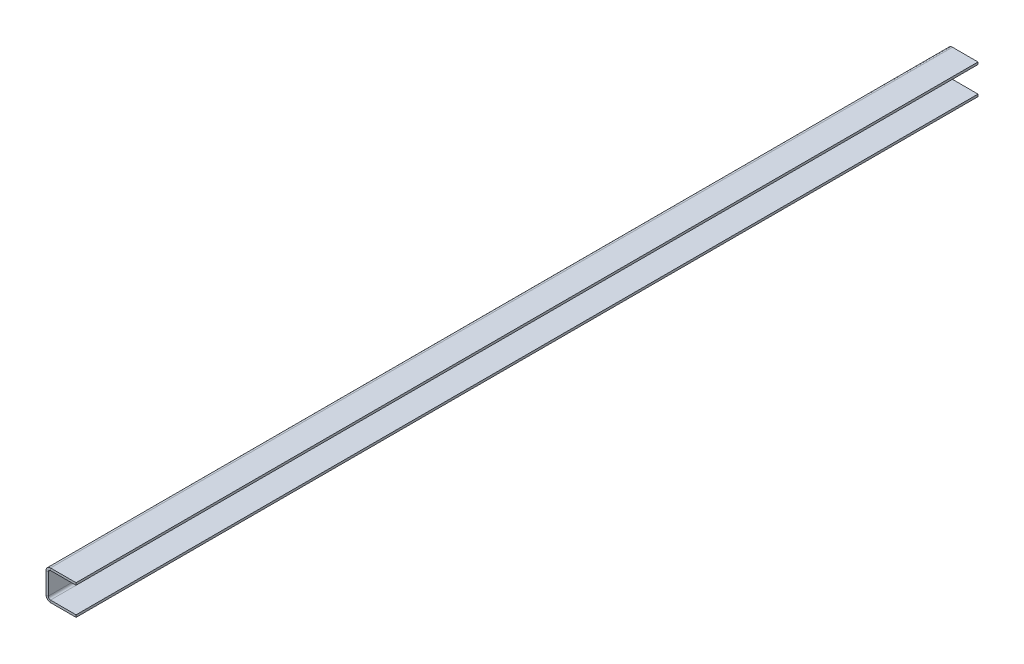
ISO-10303-21;
HEADER;
FILE_DESCRIPTION(('STEP AP214'),'2;1');
FILE_NAME('part.step','',(''),(''),'','','');
FILE_SCHEMA(('AUTOMOTIVE_DESIGN { 1 0 10303 214 1 1 1 1 }'));
ENDSEC;
DATA;
#1=APPLICATION_CONTEXT('core data for automotive mechanical design processes');
#2=APPLICATION_PROTOCOL_DEFINITION('international standard','automotive_design',2000,#1);
#3=PRODUCT_CONTEXT('',#1,'mechanical');
#4=PRODUCT('Part','Part','',(#3));
#5=PRODUCT_RELATED_PRODUCT_CATEGORY('part','',(#4));
#6=PRODUCT_DEFINITION_FORMATION('','',#4);
#7=PRODUCT_DEFINITION_CONTEXT('part definition',#1,'design');
#8=PRODUCT_DEFINITION('design','',#6,#7);
#9=PRODUCT_DEFINITION_SHAPE('','',#8);
#10=(LENGTH_UNIT() NAMED_UNIT(*) SI_UNIT(.MILLI.,.METRE.));
#11=(NAMED_UNIT(*) PLANE_ANGLE_UNIT() SI_UNIT($,.RADIAN.));
#12=(NAMED_UNIT(*) SI_UNIT($,.STERADIAN.) SOLID_ANGLE_UNIT());
#13=UNCERTAINTY_MEASURE_WITH_UNIT(LENGTH_MEASURE(1.E-05),#10,'distance_accuracy_value','');
#14=(GEOMETRIC_REPRESENTATION_CONTEXT(3) GLOBAL_UNCERTAINTY_ASSIGNED_CONTEXT((#13)) GLOBAL_UNIT_ASSIGNED_CONTEXT((#10,
#11,#12)) REPRESENTATION_CONTEXT('',''));
#15=CARTESIAN_POINT('',(0.,0.,0.));
#16=DIRECTION('',(0.,0.,1.));
#17=DIRECTION('',(1.,0.,0.));
#18=AXIS2_PLACEMENT_3D('',#15,#16,#17);
#19=CARTESIAN_POINT('',(0.,3.,300.));
#20=DIRECTION('',(0.,0.,1.));
#21=DIRECTION('',(1.,0.,0.));
#22=AXIS2_PLACEMENT_3D('',#19,#20,#21);
#23=PLANE('',#22);
#24=DIRECTION('',(1.,0.,0.));
#25=VECTOR('',#24,1.);
#26=CARTESIAN_POINT('',(0.,3.,300.));
#27=LINE('',#26,#25);
#28=CARTESIAN_POINT('',(0.,3.,300.));
#29=VERTEX_POINT('',#28);
#30=CARTESIAN_POINT('',(1.5,3.,300.));
#31=VERTEX_POINT('',#30);
#32=EDGE_CURVE('E11',#29,#31,#27,.T.);
#33=ORIENTED_EDGE('',*,*,#32,.F.);
#34=CARTESIAN_POINT('',(3.,3.,300.));
#35=DIRECTION('',(0.,0.,1.));
#36=DIRECTION('',(1.,0.,0.));
#37=AXIS2_PLACEMENT_3D('',#34,#35,#36);
#38=CIRCLE('',#37,3.);
#39=CARTESIAN_POINT('',(3.,0.,300.));
#40=VERTEX_POINT('',#39);
#41=EDGE_CURVE('E255',#40,#29,#38,.F.);
#42=ORIENTED_EDGE('',*,*,#41,.F.);
#43=DIRECTION('',(0.,-1.,0.));
#44=VECTOR('',#43,1.);
#45=CARTESIAN_POINT('',(3.,1.5,300.));
#46=LINE('',#45,#44);
#47=CARTESIAN_POINT('',(3.,1.5,300.));
#48=VERTEX_POINT('',#47);
#49=EDGE_CURVE('E53',#48,#40,#46,.T.);
#50=ORIENTED_EDGE('',*,*,#49,.F.);
#51=CARTESIAN_POINT('',(3.,3.,300.));
#52=DIRECTION('',(0.,0.,1.));
#53=DIRECTION('',(1.,0.,0.));
#54=AXIS2_PLACEMENT_3D('',#51,#52,#53);
#55=CIRCLE('',#54,1.5);
#56=EDGE_CURVE('E154',#48,#31,#55,.F.);
#57=ORIENTED_EDGE('',*,*,#56,.T.);
#58=EDGE_LOOP('',(#33,#42,#50,#57));
#59=FACE_BOUND('',#58,.T.);
#60=ADVANCED_FACE('F45',(#59),#23,.T.);
#61=CARTESIAN_POINT('',(3.,1.5,300.));
#62=DIRECTION('',(0.,0.,1.));
#63=DIRECTION('',(1.,0.,0.));
#64=AXIS2_PLACEMENT_3D('',#61,#62,#63);
#65=PLANE('',#64);
#66=DIRECTION('',(0.,1.,0.));
#67=VECTOR('',#66,1.);
#68=CARTESIAN_POINT('',(0.,20.,300.));
#69=LINE('',#68,#67);
#70=CARTESIAN_POINT('',(0.,17.,300.));
#71=VERTEX_POINT('',#70);
#72=EDGE_CURVE('E148',#29,#71,#69,.T.);
#73=ORIENTED_EDGE('',*,*,#72,.F.);
#74=ORIENTED_EDGE('',*,*,#32,.T.);
#75=DIRECTION('',(0.,1.,0.));
#76=VECTOR('',#75,1.);
#77=CARTESIAN_POINT('',(1.5,20.,300.));
#78=LINE('',#77,#76);
#79=CARTESIAN_POINT('',(1.5,17.,300.));
#80=VERTEX_POINT('',#79);
#81=EDGE_CURVE('E145',#31,#80,#78,.T.);
#82=ORIENTED_EDGE('',*,*,#81,.T.);
#83=DIRECTION('',(-1.,0.,0.));
#84=VECTOR('',#83,1.);
#85=CARTESIAN_POINT('',(1.5,17.,300.));
#86=LINE('',#85,#84);
#87=EDGE_CURVE('E236',#80,#71,#86,.T.);
#88=ORIENTED_EDGE('',*,*,#87,.T.);
#89=EDGE_LOOP('',(#73,#74,#82,#88));
#90=FACE_BOUND('',#89,.T.);
#91=ADVANCED_FACE('F143',(#90),#65,.T.);
#92=CARTESIAN_POINT('',(3.,0.,-300.));
#93=DIRECTION('',(0.,0.,-1.));
#94=DIRECTION('',(-1.,0.,0.));
#95=AXIS2_PLACEMENT_3D('',#92,#93,#94);
#96=PLANE('',#95);
#97=DIRECTION('',(0.,1.,0.));
#98=VECTOR('',#97,1.);
#99=CARTESIAN_POINT('',(3.,0.,-300.));
#100=LINE('',#99,#98);
#101=CARTESIAN_POINT('',(3.,0.,-300.));
#102=VERTEX_POINT('',#101);
#103=CARTESIAN_POINT('',(3.,1.5,-300.));
#104=VERTEX_POINT('',#103);
#105=EDGE_CURVE('E241',#102,#104,#100,.T.);
#106=ORIENTED_EDGE('',*,*,#105,.F.);
#107=CARTESIAN_POINT('',(3.,3.,-300.));
#108=DIRECTION('',(0.,0.,1.));
#109=DIRECTION('',(1.,0.,0.));
#110=AXIS2_PLACEMENT_3D('',#107,#108,#109);
#111=CIRCLE('',#110,3.);
#112=CARTESIAN_POINT('',(0.,3.,-300.));
#113=VERTEX_POINT('',#112);
#114=EDGE_CURVE('E193',#102,#113,#111,.F.);
#115=ORIENTED_EDGE('',*,*,#114,.T.);
#116=DIRECTION('',(-1.,0.,0.));
#117=VECTOR('',#116,1.);
#118=CARTESIAN_POINT('',(1.5,3.,-300.));
#119=LINE('',#118,#117);
#120=CARTESIAN_POINT('',(1.5,3.,-300.));
#121=VERTEX_POINT('',#120);
#122=EDGE_CURVE('E239',#121,#113,#119,.T.);
#123=ORIENTED_EDGE('',*,*,#122,.F.);
#124=CARTESIAN_POINT('',(3.,3.,-300.));
#125=DIRECTION('',(0.,0.,1.));
#126=DIRECTION('',(1.,0.,0.));
#127=AXIS2_PLACEMENT_3D('',#124,#125,#126);
#128=CIRCLE('',#127,1.5);
#129=EDGE_CURVE('E166',#104,#121,#128,.F.);
#130=ORIENTED_EDGE('',*,*,#129,.F.);
#131=EDGE_LOOP('',(#106,#115,#123,#130));
#132=FACE_BOUND('',#131,.T.);
#133=ADVANCED_FACE('F293',(#132),#96,.T.);
#134=CARTESIAN_POINT('',(1.5,3.,-300.));
#135=DIRECTION('',(0.,0.,-1.));
#136=DIRECTION('',(-1.,0.,0.));
#137=AXIS2_PLACEMENT_3D('',#134,#135,#136);
#138=PLANE('',#137);
#139=DIRECTION('',(-1.,0.,0.));
#140=VECTOR('',#139,1.);
#141=CARTESIAN_POINT('',(0.,0.,-300.));
#142=LINE('',#141,#140);
#143=CARTESIAN_POINT('',(20.,0.,-300.));
#144=VERTEX_POINT('',#143);
#145=EDGE_CURVE('E196',#144,#102,#142,.T.);
#146=ORIENTED_EDGE('',*,*,#145,.T.);
#147=ORIENTED_EDGE('',*,*,#105,.T.);
#148=DIRECTION('',(1.,0.,0.));
#149=VECTOR('',#148,1.);
#150=CARTESIAN_POINT('',(0.,1.5,-300.));
#151=LINE('',#150,#149);
#152=CARTESIAN_POINT('',(20.,1.5,-300.));
#153=VERTEX_POINT('',#152);
#154=EDGE_CURVE('E202',#153,#104,#151,.F.);
#155=ORIENTED_EDGE('',*,*,#154,.F.);
#156=DIRECTION('',(0.,-1.,0.));
#157=VECTOR('',#156,1.);
#158=CARTESIAN_POINT('',(20.,1.5,-300.));
#159=LINE('',#158,#157);
#160=EDGE_CURVE('E199',#153,#144,#159,.T.);
#161=ORIENTED_EDGE('',*,*,#160,.T.);
#162=EDGE_LOOP('',(#146,#147,#155,#161));
#163=FACE_BOUND('',#162,.T.);
#164=ADVANCED_FACE('F296',(#163),#138,.T.);
#165=CARTESIAN_POINT('',(3.,20.,300.));
#166=DIRECTION('',(0.,0.,1.));
#167=DIRECTION('',(1.,0.,0.));
#168=AXIS2_PLACEMENT_3D('',#165,#166,#167);
#169=PLANE('',#168);
#170=DIRECTION('',(0.,-1.,0.));
#171=VECTOR('',#170,1.);
#172=CARTESIAN_POINT('',(3.,20.,300.));
#173=LINE('',#172,#171);
#174=CARTESIAN_POINT('',(3.,20.,300.));
#175=VERTEX_POINT('',#174);
#176=CARTESIAN_POINT('',(3.,18.5,300.));
#177=VERTEX_POINT('',#176);
#178=EDGE_CURVE('E61',#175,#177,#173,.T.);
#179=ORIENTED_EDGE('',*,*,#178,.F.);
#180=CARTESIAN_POINT('',(3.,17.,300.));
#181=DIRECTION('',(0.,0.,1.));
#182=DIRECTION('',(1.,0.,0.));
#183=AXIS2_PLACEMENT_3D('',#180,#181,#182);
#184=CIRCLE('',#183,3.);
#185=EDGE_CURVE('E265',#71,#175,#184,.F.);
#186=ORIENTED_EDGE('',*,*,#185,.F.);
#187=ORIENTED_EDGE('',*,*,#87,.F.);
#188=CARTESIAN_POINT('',(3.,17.,300.));
#189=DIRECTION('',(0.,0.,1.));
#190=DIRECTION('',(1.,0.,0.));
#191=AXIS2_PLACEMENT_3D('',#188,#189,#190);
#192=CIRCLE('',#191,1.5);
#193=EDGE_CURVE('E174',#80,#177,#192,.F.);
#194=ORIENTED_EDGE('',*,*,#193,.T.);
#195=EDGE_LOOP('',(#179,#186,#187,#194));
#196=FACE_BOUND('',#195,.T.);
#197=ADVANCED_FACE('F288',(#196),#169,.T.);
#198=CARTESIAN_POINT('',(1.5,17.,300.));
#199=DIRECTION('',(0.,0.,1.));
#200=DIRECTION('',(1.,0.,0.));
#201=AXIS2_PLACEMENT_3D('',#198,#199,#200);
#202=PLANE('',#201);
#203=DIRECTION('',(1.,0.,0.));
#204=VECTOR('',#203,1.);
#205=CARTESIAN_POINT('',(0.,20.,300.));
#206=LINE('',#205,#204);
#207=CARTESIAN_POINT('',(20.,20.,300.));
#208=VERTEX_POINT('',#207);
#209=EDGE_CURVE('E268',#175,#208,#206,.T.);
#210=ORIENTED_EDGE('',*,*,#209,.F.);
#211=ORIENTED_EDGE('',*,*,#178,.T.);
#212=DIRECTION('',(1.,0.,0.));
#213=VECTOR('',#212,1.);
#214=CARTESIAN_POINT('',(0.,18.5,300.));
#215=LINE('',#214,#213);
#216=CARTESIAN_POINT('',(20.,18.5,300.));
#217=VERTEX_POINT('',#216);
#218=EDGE_CURVE('E115',#177,#217,#215,.T.);
#219=ORIENTED_EDGE('',*,*,#218,.T.);
#220=DIRECTION('',(0.,-1.,0.));
#221=VECTOR('',#220,1.);
#222=CARTESIAN_POINT('',(20.,20.,300.));
#223=LINE('',#222,#221);
#224=EDGE_CURVE('E271',#208,#217,#223,.T.);
#225=ORIENTED_EDGE('',*,*,#224,.F.);
#226=EDGE_LOOP('',(#210,#211,#219,#225));
#227=FACE_BOUND('',#226,.T.);
#228=ADVANCED_FACE('F277',(#227),#202,.T.);
#229=CARTESIAN_POINT('',(0.,17.,-300.));
#230=DIRECTION('',(0.,0.,-1.));
#231=DIRECTION('',(-1.,0.,0.));
#232=AXIS2_PLACEMENT_3D('',#229,#230,#231);
#233=PLANE('',#232);
#234=DIRECTION('',(1.,0.,0.));
#235=VECTOR('',#234,1.);
#236=CARTESIAN_POINT('',(0.,17.,-300.));
#237=LINE('',#236,#235);
#238=CARTESIAN_POINT('',(0.,17.,-300.));
#239=VERTEX_POINT('',#238);
#240=CARTESIAN_POINT('',(1.5,17.,-300.));
#241=VERTEX_POINT('',#240);
#242=EDGE_CURVE('E102',#239,#241,#237,.T.);
#243=ORIENTED_EDGE('',*,*,#242,.F.);
#244=CARTESIAN_POINT('',(3.,17.,-300.));
#245=DIRECTION('',(0.,0.,1.));
#246=DIRECTION('',(1.,0.,0.));
#247=AXIS2_PLACEMENT_3D('',#244,#245,#246);
#248=CIRCLE('',#247,3.);
#249=CARTESIAN_POINT('',(3.,20.,-300.));
#250=VERTEX_POINT('',#249);
#251=EDGE_CURVE('E189',#239,#250,#248,.F.);
#252=ORIENTED_EDGE('',*,*,#251,.T.);
#253=DIRECTION('',(0.,1.,0.));
#254=VECTOR('',#253,1.);
#255=CARTESIAN_POINT('',(3.,18.5,-300.));
#256=LINE('',#255,#254);
#257=CARTESIAN_POINT('',(3.,18.5,-300.));
#258=VERTEX_POINT('',#257);
#259=EDGE_CURVE('E109',#258,#250,#256,.T.);
#260=ORIENTED_EDGE('',*,*,#259,.F.);
#261=CARTESIAN_POINT('',(3.,17.,-300.));
#262=DIRECTION('',(0.,0.,1.));
#263=DIRECTION('',(1.,0.,0.));
#264=AXIS2_PLACEMENT_3D('',#261,#262,#263);
#265=CIRCLE('',#264,1.5);
#266=EDGE_CURVE('E208',#241,#258,#265,.F.);
#267=ORIENTED_EDGE('',*,*,#266,.F.);
#268=EDGE_LOOP('',(#243,#252,#260,#267));
#269=FACE_BOUND('',#268,.T.);
#270=ADVANCED_FACE('F325',(#269),#233,.T.);
#271=CARTESIAN_POINT('',(3.,18.5,-300.));
#272=DIRECTION('',(0.,0.,-1.));
#273=DIRECTION('',(-1.,0.,0.));
#274=AXIS2_PLACEMENT_3D('',#271,#272,#273);
#275=PLANE('',#274);
#276=DIRECTION('',(0.,1.,0.));
#277=VECTOR('',#276,1.);
#278=CARTESIAN_POINT('',(0.,20.,-300.));
#279=LINE('',#278,#277);
#280=EDGE_CURVE('E191',#113,#239,#279,.T.);
#281=ORIENTED_EDGE('',*,*,#280,.T.);
#282=ORIENTED_EDGE('',*,*,#242,.T.);
#283=DIRECTION('',(0.,1.,0.));
#284=VECTOR('',#283,1.);
#285=CARTESIAN_POINT('',(1.5,20.,-300.));
#286=LINE('',#285,#284);
#287=EDGE_CURVE('E206',#121,#241,#286,.T.);
#288=ORIENTED_EDGE('',*,*,#287,.F.);
#289=ORIENTED_EDGE('',*,*,#122,.T.);
#290=EDGE_LOOP('',(#281,#282,#288,#289));
#291=FACE_BOUND('',#290,.T.);
#292=ADVANCED_FACE('F328',(#291),#275,.T.);
#293=CARTESIAN_POINT('',(0.,18.5,300.));
#294=DIRECTION('',(0.,1.,0.));
#295=DIRECTION('',(0.,0.,1.));
#296=AXIS2_PLACEMENT_3D('',#293,#294,#295);
#297=PLANE('',#296);
#298=DIRECTION('',(1.,0.,0.));
#299=VECTOR('',#298,1.);
#300=CARTESIAN_POINT('',(0.,18.5,-300.));
#301=LINE('',#300,#299);
#302=CARTESIAN_POINT('',(20.,18.5,-300.));
#303=VERTEX_POINT('',#302);
#304=EDGE_CURVE('E180',#258,#303,#301,.T.);
#305=ORIENTED_EDGE('',*,*,#304,.T.);
#306=DIRECTION('',(0.,0.,-1.));
#307=VECTOR('',#306,1.);
#308=CARTESIAN_POINT('',(20.,18.5,300.));
#309=LINE('',#308,#307);
#310=EDGE_CURVE('E232',#217,#303,#309,.T.);
#311=ORIENTED_EDGE('',*,*,#310,.F.);
#312=ORIENTED_EDGE('',*,*,#218,.F.);
#313=DIRECTION('',(0.,0.,-1.));
#314=VECTOR('',#313,1.);
#315=CARTESIAN_POINT('',(3.,18.5,300.));
#316=LINE('',#315,#314);
#317=EDGE_CURVE('E176',#177,#258,#316,.T.);
#318=ORIENTED_EDGE('',*,*,#317,.T.);
#319=EDGE_LOOP('',(#305,#311,#312,#318));
#320=FACE_BOUND('',#319,.T.);
#321=ADVANCED_FACE('F331',(#320),#297,.F.);
#322=CARTESIAN_POINT('',(20.,20.,300.));
#323=DIRECTION('',(1.,0.,0.));
#324=DIRECTION('',(0.,0.,-1.));
#325=AXIS2_PLACEMENT_3D('',#322,#323,#324);
#326=PLANE('',#325);
#327=DIRECTION('',(0.,-1.,0.));
#328=VECTOR('',#327,1.);
#329=CARTESIAN_POINT('',(20.,20.,-300.));
#330=LINE('',#329,#328);
#331=CARTESIAN_POINT('',(20.,20.,-300.));
#332=VERTEX_POINT('',#331);
#333=EDGE_CURVE('E183',#332,#303,#330,.T.);
#334=ORIENTED_EDGE('',*,*,#333,.F.);
#335=DIRECTION('',(0.,0.,-1.));
#336=VECTOR('',#335,1.);
#337=CARTESIAN_POINT('',(20.,20.,300.));
#338=LINE('',#337,#336);
#339=EDGE_CURVE('E230',#208,#332,#338,.T.);
#340=ORIENTED_EDGE('',*,*,#339,.F.);
#341=ORIENTED_EDGE('',*,*,#224,.T.);
#342=ORIENTED_EDGE('',*,*,#310,.T.);
#343=EDGE_LOOP('',(#334,#340,#341,#342));
#344=FACE_BOUND('',#343,.T.);
#345=ADVANCED_FACE('F276',(#344),#326,.T.);
#346=CARTESIAN_POINT('',(0.,20.,300.));
#347=DIRECTION('',(0.,1.,0.));
#348=DIRECTION('',(0.,0.,1.));
#349=AXIS2_PLACEMENT_3D('',#346,#347,#348);
#350=PLANE('',#349);
#351=DIRECTION('',(1.,0.,0.));
#352=VECTOR('',#351,1.);
#353=CARTESIAN_POINT('',(0.,20.,-300.));
#354=LINE('',#353,#352);
#355=EDGE_CURVE('E186',#250,#332,#354,.T.);
#356=ORIENTED_EDGE('',*,*,#355,.F.);
#357=DIRECTION('',(0.,0.,-1.));
#358=VECTOR('',#357,1.);
#359=CARTESIAN_POINT('',(3.,20.,300.));
#360=LINE('',#359,#358);
#361=EDGE_CURVE('E227',#175,#250,#360,.T.);
#362=ORIENTED_EDGE('',*,*,#361,.F.);
#363=ORIENTED_EDGE('',*,*,#209,.T.);
#364=ORIENTED_EDGE('',*,*,#339,.T.);
#365=EDGE_LOOP('',(#356,#362,#363,#364));
#366=FACE_BOUND('',#365,.T.);
#367=ADVANCED_FACE('F281',(#366),#350,.T.);
#368=CARTESIAN_POINT('',(3.,17.,300.));
#369=DIRECTION('',(0.,0.,-1.));
#370=DIRECTION('',(-1.,0.,0.));
#371=AXIS2_PLACEMENT_3D('',#368,#369,#370);
#372=CYLINDRICAL_SURFACE('',#371,3.);
#373=ORIENTED_EDGE('',*,*,#251,.F.);
#374=DIRECTION('',(0.,0.,-1.));
#375=VECTOR('',#374,1.);
#376=CARTESIAN_POINT('',(0.,17.,300.));
#377=LINE('',#376,#375);
#378=EDGE_CURVE('E224',#71,#239,#377,.T.);
#379=ORIENTED_EDGE('',*,*,#378,.F.);
#380=ORIENTED_EDGE('',*,*,#185,.T.);
#381=ORIENTED_EDGE('',*,*,#361,.T.);
#382=EDGE_LOOP('',(#373,#379,#380,#381));
#383=FACE_BOUND('',#382,.T.);
#384=ADVANCED_FACE('F284',(#383),#372,.T.);
#385=CARTESIAN_POINT('',(0.,20.,300.));
#386=DIRECTION('',(-1.,0.,0.));
#387=DIRECTION('',(0.,-1.,0.));
#388=AXIS2_PLACEMENT_3D('',#385,#386,#387);
#389=PLANE('',#388);
#390=ORIENTED_EDGE('',*,*,#280,.F.);
#391=DIRECTION('',(0.,0.,-1.));
#392=VECTOR('',#391,1.);
#393=CARTESIAN_POINT('',(0.,3.,300.));
#394=LINE('',#393,#392);
#395=EDGE_CURVE('E221',#29,#113,#394,.T.);
#396=ORIENTED_EDGE('',*,*,#395,.F.);
#397=ORIENTED_EDGE('',*,*,#72,.T.);
#398=ORIENTED_EDGE('',*,*,#378,.T.);
#399=EDGE_LOOP('',(#390,#396,#397,#398));
#400=FACE_BOUND('',#399,.T.);
#401=ADVANCED_FACE('F291',(#400),#389,.T.);
#402=CARTESIAN_POINT('',(3.,3.,300.));
#403=DIRECTION('',(0.,0.,-1.));
#404=DIRECTION('',(-1.,0.,0.));
#405=AXIS2_PLACEMENT_3D('',#402,#403,#404);
#406=CYLINDRICAL_SURFACE('',#405,3.);
#407=ORIENTED_EDGE('',*,*,#114,.F.);
#408=DIRECTION('',(0.,0.,-1.));
#409=VECTOR('',#408,1.);
#410=CARTESIAN_POINT('',(3.,0.,300.));
#411=LINE('',#410,#409);
#412=EDGE_CURVE('E218',#40,#102,#411,.T.);
#413=ORIENTED_EDGE('',*,*,#412,.F.);
#414=ORIENTED_EDGE('',*,*,#41,.T.);
#415=ORIENTED_EDGE('',*,*,#395,.T.);
#416=EDGE_LOOP('',(#407,#413,#414,#415));
#417=FACE_BOUND('',#416,.T.);
#418=ADVANCED_FACE('F254',(#417),#406,.T.);
#419=CARTESIAN_POINT('',(0.,0.,300.));
#420=DIRECTION('',(0.,-1.,0.));
#421=DIRECTION('',(0.,0.,-1.));
#422=AXIS2_PLACEMENT_3D('',#419,#420,#421);
#423=PLANE('',#422);
#424=ORIENTED_EDGE('',*,*,#145,.F.);
#425=DIRECTION('',(0.,0.,-1.));
#426=VECTOR('',#425,1.);
#427=CARTESIAN_POINT('',(20.,0.,300.));
#428=LINE('',#427,#426);
#429=CARTESIAN_POINT('',(20.,0.,300.));
#430=VERTEX_POINT('',#429);
#431=EDGE_CURVE('E216',#430,#144,#428,.T.);
#432=ORIENTED_EDGE('',*,*,#431,.F.);
#433=DIRECTION('',(-1.,0.,0.));
#434=VECTOR('',#433,1.);
#435=CARTESIAN_POINT('',(0.,0.,300.));
#436=LINE('',#435,#434);
#437=EDGE_CURVE('E248',#430,#40,#436,.T.);
#438=ORIENTED_EDGE('',*,*,#437,.T.);
#439=ORIENTED_EDGE('',*,*,#412,.T.);
#440=EDGE_LOOP('',(#424,#432,#438,#439));
#441=FACE_BOUND('',#440,.T.);
#442=ADVANCED_FACE('F259',(#441),#423,.T.);
#443=CARTESIAN_POINT('',(20.,1.5,300.));
#444=DIRECTION('',(1.,0.,0.));
#445=DIRECTION('',(0.,0.,-1.));
#446=AXIS2_PLACEMENT_3D('',#443,#444,#445);
#447=PLANE('',#446);
#448=ORIENTED_EDGE('',*,*,#160,.F.);
#449=DIRECTION('',(0.,0.,-1.));
#450=VECTOR('',#449,1.);
#451=CARTESIAN_POINT('',(20.,1.5,300.));
#452=LINE('',#451,#450);
#453=CARTESIAN_POINT('',(20.,1.5,300.));
#454=VERTEX_POINT('',#453);
#455=EDGE_CURVE('E214',#454,#153,#452,.T.);
#456=ORIENTED_EDGE('',*,*,#455,.F.);
#457=DIRECTION('',(0.,-1.,0.));
#458=VECTOR('',#457,1.);
#459=CARTESIAN_POINT('',(20.,1.5,300.));
#460=LINE('',#459,#458);
#461=EDGE_CURVE('E260',#454,#430,#460,.T.);
#462=ORIENTED_EDGE('',*,*,#461,.T.);
#463=ORIENTED_EDGE('',*,*,#431,.T.);
#464=EDGE_LOOP('',(#448,#456,#462,#463));
#465=FACE_BOUND('',#464,.T.);
#466=ADVANCED_FACE('F301',(#465),#447,.T.);
#467=CARTESIAN_POINT('',(0.,1.5,300.));
#468=DIRECTION('',(0.,-1.,0.));
#469=DIRECTION('',(0.,0.,-1.));
#470=AXIS2_PLACEMENT_3D('',#467,#468,#469);
#471=PLANE('',#470);
#472=ORIENTED_EDGE('',*,*,#154,.T.);
#473=DIRECTION('',(0.,0.,-1.));
#474=VECTOR('',#473,1.);
#475=CARTESIAN_POINT('',(3.,1.5,300.));
#476=LINE('',#475,#474);
#477=EDGE_CURVE('E168',#48,#104,#476,.T.);
#478=ORIENTED_EDGE('',*,*,#477,.F.);
#479=DIRECTION('',(1.,0.,0.));
#480=VECTOR('',#479,1.);
#481=CARTESIAN_POINT('',(0.,1.5,300.));
#482=LINE('',#481,#480);
#483=EDGE_CURVE('E159',#454,#48,#482,.F.);
#484=ORIENTED_EDGE('',*,*,#483,.F.);
#485=ORIENTED_EDGE('',*,*,#455,.T.);
#486=EDGE_LOOP('',(#472,#478,#484,#485));
#487=FACE_BOUND('',#486,.T.);
#488=ADVANCED_FACE('F299',(#487),#471,.F.);
#489=CARTESIAN_POINT('',(3.,3.,300.));
#490=DIRECTION('',(0.,0.,-1.));
#491=DIRECTION('',(-1.,0.,0.));
#492=AXIS2_PLACEMENT_3D('',#489,#490,#491);
#493=CYLINDRICAL_SURFACE('',#492,1.5);
#494=ORIENTED_EDGE('',*,*,#129,.T.);
#495=DIRECTION('',(0.,0.,-1.));
#496=VECTOR('',#495,1.);
#497=CARTESIAN_POINT('',(1.5,3.,300.));
#498=LINE('',#497,#496);
#499=EDGE_CURVE('E163',#31,#121,#498,.T.);
#500=ORIENTED_EDGE('',*,*,#499,.F.);
#501=ORIENTED_EDGE('',*,*,#56,.F.);
#502=ORIENTED_EDGE('',*,*,#477,.T.);
#503=EDGE_LOOP('',(#494,#500,#501,#502));
#504=FACE_BOUND('',#503,.T.);
#505=ADVANCED_FACE('F164',(#504),#493,.F.);
#506=CARTESIAN_POINT('',(1.5,20.,300.));
#507=DIRECTION('',(-1.,0.,0.));
#508=DIRECTION('',(0.,-1.,0.));
#509=AXIS2_PLACEMENT_3D('',#506,#507,#508);
#510=PLANE('',#509);
#511=ORIENTED_EDGE('',*,*,#287,.T.);
#512=DIRECTION('',(0.,0.,-1.));
#513=VECTOR('',#512,1.);
#514=CARTESIAN_POINT('',(1.5,17.,300.));
#515=LINE('',#514,#513);
#516=EDGE_CURVE('E169',#80,#241,#515,.T.);
#517=ORIENTED_EDGE('',*,*,#516,.F.);
#518=ORIENTED_EDGE('',*,*,#81,.F.);
#519=ORIENTED_EDGE('',*,*,#499,.T.);
#520=EDGE_LOOP('',(#511,#517,#518,#519));
#521=FACE_BOUND('',#520,.T.);
#522=ADVANCED_FACE('F171',(#521),#510,.F.);
#523=CARTESIAN_POINT('',(3.,17.,300.));
#524=DIRECTION('',(0.,0.,-1.));
#525=DIRECTION('',(-1.,0.,0.));
#526=AXIS2_PLACEMENT_3D('',#523,#524,#525);
#527=CYLINDRICAL_SURFACE('',#526,1.5);
#528=ORIENTED_EDGE('',*,*,#266,.T.);
#529=ORIENTED_EDGE('',*,*,#317,.F.);
#530=ORIENTED_EDGE('',*,*,#193,.F.);
#531=ORIENTED_EDGE('',*,*,#516,.T.);
#532=EDGE_LOOP('',(#528,#529,#530,#531));
#533=FACE_BOUND('',#532,.T.);
#534=ADVANCED_FACE('F385',(#533),#527,.F.);
#535=CARTESIAN_POINT('',(3.,17.,300.));
#536=DIRECTION('',(0.,0.,1.));
#537=DIRECTION('',(1.,0.,0.));
#538=AXIS2_PLACEMENT_3D('',#535,#536,#537);
#539=PLANE('',#538);
#540=ORIENTED_EDGE('',*,*,#483,.T.);
#541=ORIENTED_EDGE('',*,*,#49,.T.);
#542=ORIENTED_EDGE('',*,*,#437,.F.);
#543=ORIENTED_EDGE('',*,*,#461,.F.);
#544=EDGE_LOOP('',(#540,#541,#542,#543));
#545=FACE_BOUND('',#544,.T.);
#546=ADVANCED_FACE('F245',(#545),#539,.T.);
#547=CARTESIAN_POINT('',(3.,17.,-300.));
#548=DIRECTION('',(0.,0.,1.));
#549=DIRECTION('',(1.,0.,0.));
#550=AXIS2_PLACEMENT_3D('',#547,#548,#549);
#551=PLANE('',#550);
#552=ORIENTED_EDGE('',*,*,#304,.F.);
#553=ORIENTED_EDGE('',*,*,#259,.T.);
#554=ORIENTED_EDGE('',*,*,#355,.T.);
#555=ORIENTED_EDGE('',*,*,#333,.T.);
#556=EDGE_LOOP('',(#552,#553,#554,#555));
#557=FACE_BOUND('',#556,.T.);
#558=ADVANCED_FACE('F405',(#557),#551,.F.);
#559=CLOSED_SHELL('',(#60,#91,#133,#164,#197,#228,#270,#292,#321,#345,#367,#384,#401,#418,#442,
#466,#488,#505,#522,#534,#546,#558));
#560=MANIFOLD_SOLID_BREP('B2',#559);
#561=ADVANCED_BREP_SHAPE_REPRESENTATION('',(#18,#560),#14);
#562=SHAPE_DEFINITION_REPRESENTATION(#9,#561);
ENDSEC;
END-ISO-10303-21;
